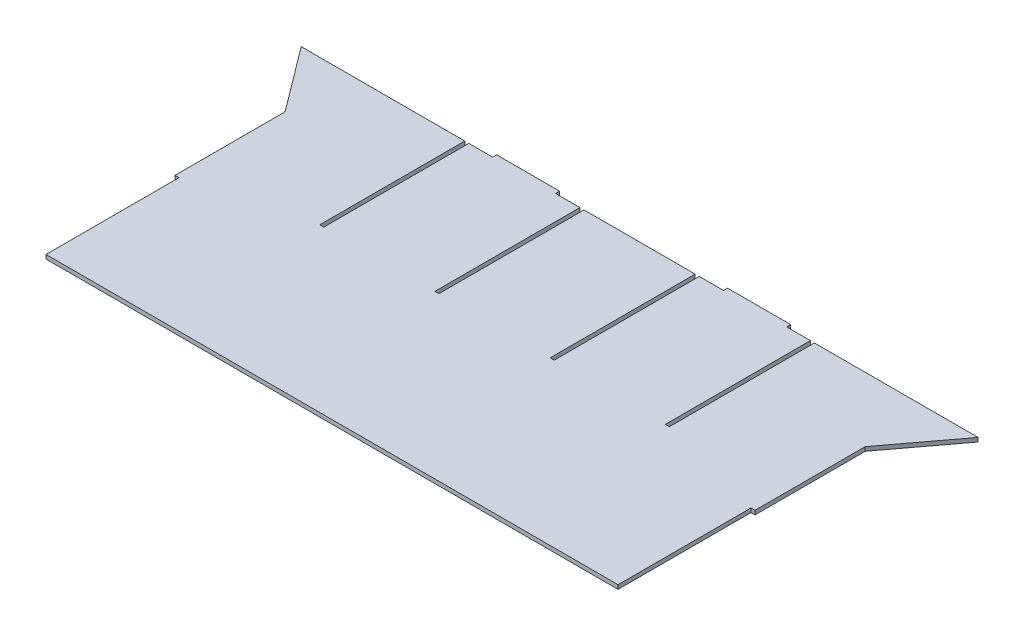
ISO-10303-21;
HEADER;
FILE_DESCRIPTION(('STEP AP214'),'2;1');
FILE_NAME('part.step','',(''),(''),'','','');
FILE_SCHEMA(('AUTOMOTIVE_DESIGN { 1 0 10303 214 1 1 1 1 }'));
ENDSEC;
DATA;
#1=APPLICATION_CONTEXT('core data for automotive mechanical design processes');
#2=APPLICATION_PROTOCOL_DEFINITION('international standard','automotive_design',2000,#1);
#3=PRODUCT_CONTEXT('',#1,'mechanical');
#4=PRODUCT('Part','Part','',(#3));
#5=PRODUCT_RELATED_PRODUCT_CATEGORY('part','',(#4));
#6=PRODUCT_DEFINITION_FORMATION('','',#4);
#7=PRODUCT_DEFINITION_CONTEXT('part definition',#1,'design');
#8=PRODUCT_DEFINITION('design','',#6,#7);
#9=PRODUCT_DEFINITION_SHAPE('','',#8);
#10=(LENGTH_UNIT() NAMED_UNIT(*) SI_UNIT(.MILLI.,.METRE.));
#11=(NAMED_UNIT(*) PLANE_ANGLE_UNIT() SI_UNIT($,.RADIAN.));
#12=(NAMED_UNIT(*) SI_UNIT($,.STERADIAN.) SOLID_ANGLE_UNIT());
#13=UNCERTAINTY_MEASURE_WITH_UNIT(LENGTH_MEASURE(1.E-05),#10,'distance_accuracy_value','');
#14=(GEOMETRIC_REPRESENTATION_CONTEXT(3) GLOBAL_UNCERTAINTY_ASSIGNED_CONTEXT((#13)) GLOBAL_UNIT_ASSIGNED_CONTEXT((#10,
#11,#12)) REPRESENTATION_CONTEXT('',''));
#15=CARTESIAN_POINT('',(0.,0.,0.));
#16=DIRECTION('',(0.,0.,1.));
#17=DIRECTION('',(1.,0.,0.));
#18=AXIS2_PLACEMENT_3D('',#15,#16,#17);
#19=CARTESIAN_POINT('',(228.6010033,-1.5875,242.425000036));
#20=DIRECTION('',(-1.,0.,0.));
#21=DIRECTION('',(0.,0.,1.));
#22=AXIS2_PLACEMENT_3D('',#19,#20,#21);
#23=PLANE('',#22);
#24=DIRECTION('',(0.,-1.,0.));
#25=VECTOR('',#24,1.);
#26=CARTESIAN_POINT('',(228.6010033,1.5875,137.650000036));
#27=LINE('',#26,#25);
#28=CARTESIAN_POINT('',(228.6010033,1.5875,137.650000036));
#29=VERTEX_POINT('',#28);
#30=CARTESIAN_POINT('',(228.6010033,-1.5875,137.650000036));
#31=VERTEX_POINT('',#30);
#32=EDGE_CURVE('E266',#29,#31,#27,.T.);
#33=ORIENTED_EDGE('',*,*,#32,.T.);
#34=DIRECTION('',(0.,0.,-1.));
#35=VECTOR('',#34,1.);
#36=CARTESIAN_POINT('',(228.6010033,-1.5875,242.425000036));
#37=LINE('',#36,#35);
#38=CARTESIAN_POINT('',(228.6010033,-1.5875,50.8));
#39=VERTEX_POINT('',#38);
#40=EDGE_CURVE('E482',#31,#39,#37,.T.);
#41=ORIENTED_EDGE('',*,*,#40,.T.);
#42=DIRECTION('',(0.,-1.,0.));
#43=VECTOR('',#42,1.);
#44=CARTESIAN_POINT('',(228.6010033,1.5875,50.8));
#45=LINE('',#44,#43);
#46=CARTESIAN_POINT('',(228.6010033,1.5875,50.8));
#47=VERTEX_POINT('',#46);
#48=EDGE_CURVE('E309',#47,#39,#45,.T.);
#49=ORIENTED_EDGE('',*,*,#48,.F.);
#50=DIRECTION('',(0.,0.,-1.));
#51=VECTOR('',#50,1.);
#52=CARTESIAN_POINT('',(228.6010033,1.5875,242.425000036));
#53=LINE('',#52,#51);
#54=EDGE_CURVE('E11',#29,#47,#53,.T.);
#55=ORIENTED_EDGE('',*,*,#54,.F.);
#56=EDGE_LOOP('',(#33,#41,#49,#55));
#57=FACE_BOUND('',#56,.T.);
#58=ADVANCED_FACE('F41',(#57),#23,.F.);
#59=CARTESIAN_POINT('',(-228.6010033,1.5875,242.425000036));
#60=DIRECTION('',(0.,-1.,0.));
#61=DIRECTION('',(0.,0.,-1.));
#62=AXIS2_PLACEMENT_3D('',#59,#60,#61);
#63=PLANE('',#62);
#64=DIRECTION('',(-1.,0.,0.));
#65=VECTOR('',#64,1.);
#66=CARTESIAN_POINT('',(228.6010033,1.5875,137.650000036));
#67=LINE('',#66,#65);
#68=CARTESIAN_POINT('',(225.4260033,1.5875,137.650000036));
#69=VERTEX_POINT('',#68);
#70=EDGE_CURVE('E261',#29,#69,#67,.T.);
#71=ORIENTED_EDGE('',*,*,#70,.F.);
#72=ORIENTED_EDGE('',*,*,#54,.T.);
#73=DIRECTION('',(0.6,0.,-0.8));
#74=VECTOR('',#73,1.);
#75=CARTESIAN_POINT('',(266.7010033,1.5875,0.));
#76=LINE('',#75,#74);
#77=CARTESIAN_POINT('',(266.7010033,1.5875,0.));
#78=VERTEX_POINT('',#77);
#79=EDGE_CURVE('E303',#47,#78,#76,.T.);
#80=ORIENTED_EDGE('',*,*,#79,.T.);
#81=DIRECTION('',(-1.,0.,0.));
#82=VECTOR('',#81,1.);
#83=CARTESIAN_POINT('',(-228.6010033,1.5875,0.));
#84=LINE('',#83,#82);
#85=CARTESIAN_POINT('',(137.7960033,1.5875,0.));
#86=VERTEX_POINT('',#85);
#87=EDGE_CURVE('E483',#78,#86,#84,.T.);
#88=ORIENTED_EDGE('',*,*,#87,.T.);
#89=DIRECTION('',(0.,0.,1.));
#90=VECTOR('',#89,1.);
#91=CARTESIAN_POINT('',(137.7960033,1.5875,0.));
#92=LINE('',#91,#90);
#93=CARTESIAN_POINT('',(137.7960033,1.5875,114.3));
#94=VERTEX_POINT('',#93);
#95=EDGE_CURVE('E394',#86,#94,#92,.T.);
#96=ORIENTED_EDGE('',*,*,#95,.T.);
#97=DIRECTION('',(1.,0.,0.));
#98=VECTOR('',#97,1.);
#99=CARTESIAN_POINT('',(0.,1.5875,114.3));
#100=LINE('',#99,#98);
#101=CARTESIAN_POINT('',(134.6210033,1.5875,114.3));
#102=VERTEX_POINT('',#101);
#103=EDGE_CURVE('E454',#102,#94,#100,.T.);
#104=ORIENTED_EDGE('',*,*,#103,.F.);
#105=DIRECTION('',(0.,0.,1.));
#106=VECTOR('',#105,1.);
#107=CARTESIAN_POINT('',(134.6210033,1.5875,0.));
#108=LINE('',#107,#106);
#109=CARTESIAN_POINT('',(134.6210033,1.5875,0.));
#110=VERTEX_POINT('',#109);
#111=EDGE_CURVE('E463',#110,#102,#108,.T.);
#112=ORIENTED_EDGE('',*,*,#111,.F.);
#113=CARTESIAN_POINT('',(115.839003272,1.58749999999999,0.));
#114=VERTEX_POINT('',#113);
#115=EDGE_CURVE('E487',#110,#114,#84,.T.);
#116=ORIENTED_EDGE('',*,*,#115,.T.);
#117=DIRECTION('',(0.,0.,1.));
#118=VECTOR('',#117,1.);
#119=CARTESIAN_POINT('',(115.839003272,1.58749999999999,-3.175));
#120=LINE('',#119,#118);
#121=CARTESIAN_POINT('',(115.839003272,1.58749999999999,-3.175));
#122=VERTEX_POINT('',#121);
#123=EDGE_CURVE('E360',#122,#114,#120,.T.);
#124=ORIENTED_EDGE('',*,*,#123,.F.);
#125=DIRECTION('',(1.,0.,0.));
#126=VECTOR('',#125,1.);
#127=CARTESIAN_POINT('',(115.839003272,1.58749999999999,-3.175));
#128=LINE('',#127,#126);
#129=CARTESIAN_POINT('',(66.1801916664823,1.58749999999999,-3.175));
#130=VERTEX_POINT('',#129);
#131=EDGE_CURVE('E358',#130,#122,#128,.T.);
#132=ORIENTED_EDGE('',*,*,#131,.F.);
#133=DIRECTION('',(0.,0.,1.));
#134=VECTOR('',#133,1.);
#135=CARTESIAN_POINT('',(66.1801916664823,1.58749999999999,-3.175));
#136=LINE('',#135,#134);
#137=CARTESIAN_POINT('',(66.1801916664823,1.5875,0.));
#138=VERTEX_POINT('',#137);
#139=EDGE_CURVE('E366',#130,#138,#136,.T.);
#140=ORIENTED_EDGE('',*,*,#139,.T.);
#141=CARTESIAN_POINT('',(46.9890033,1.5875,0.));
#142=VERTEX_POINT('',#141);
#143=EDGE_CURVE('E512',#138,#142,#84,.T.);
#144=ORIENTED_EDGE('',*,*,#143,.T.);
#145=DIRECTION('',(0.,0.,1.));
#146=VECTOR('',#145,1.);
#147=CARTESIAN_POINT('',(46.9890033,1.5875,0.));
#148=LINE('',#147,#146);
#149=CARTESIAN_POINT('',(46.9890033,1.5875,114.3));
#150=VERTEX_POINT('',#149);
#151=EDGE_CURVE('E383',#142,#150,#148,.T.);
#152=ORIENTED_EDGE('',*,*,#151,.T.);
#153=DIRECTION('',(1.,0.,0.));
#154=VECTOR('',#153,1.);
#155=CARTESIAN_POINT('',(-90.807,1.5875,114.3));
#156=LINE('',#155,#154);
#157=CARTESIAN_POINT('',(43.8140033000001,1.5875,114.3));
#158=VERTEX_POINT('',#157);
#159=EDGE_CURVE('E376',#158,#150,#156,.T.);
#160=ORIENTED_EDGE('',*,*,#159,.F.);
#161=DIRECTION('',(0.,0.,1.));
#162=VECTOR('',#161,1.);
#163=CARTESIAN_POINT('',(43.8140033,1.5875,0.));
#164=LINE('',#163,#162);
#165=CARTESIAN_POINT('',(43.8140033,1.5875,0.));
#166=VERTEX_POINT('',#165);
#167=EDGE_CURVE('E386',#166,#158,#164,.T.);
#168=ORIENTED_EDGE('',*,*,#167,.F.);
#169=CARTESIAN_POINT('',(-43.8179967,1.5875,0.));
#170=VERTEX_POINT('',#169);
#171=EDGE_CURVE('E554',#166,#170,#84,.T.);
#172=ORIENTED_EDGE('',*,*,#171,.T.);
#173=DIRECTION('',(0.,0.,1.));
#174=VECTOR('',#173,1.);
#175=CARTESIAN_POINT('',(-43.8179967,1.5875,0.));
#176=LINE('',#175,#174);
#177=CARTESIAN_POINT('',(-43.8179967,1.5875,114.3));
#178=VERTEX_POINT('',#177);
#179=EDGE_CURVE('E411',#170,#178,#176,.T.);
#180=ORIENTED_EDGE('',*,*,#179,.T.);
#181=DIRECTION('',(1.,0.,0.));
#182=VECTOR('',#181,1.);
#183=CARTESIAN_POINT('',(-181.614,1.5875,114.3));
#184=LINE('',#183,#182);
#185=CARTESIAN_POINT('',(-46.9929966999999,1.5875,114.3));
#186=VERTEX_POINT('',#185);
#187=EDGE_CURVE('E404',#186,#178,#184,.T.);
#188=ORIENTED_EDGE('',*,*,#187,.F.);
#189=DIRECTION('',(0.,0.,1.));
#190=VECTOR('',#189,1.);
#191=CARTESIAN_POINT('',(-46.9929967,1.5875,0.));
#192=LINE('',#191,#190);
#193=CARTESIAN_POINT('',(-46.9929967,1.5875,0.));
#194=VERTEX_POINT('',#193);
#195=EDGE_CURVE('E414',#194,#186,#192,.T.);
#196=ORIENTED_EDGE('',*,*,#195,.F.);
#197=CARTESIAN_POINT('',(-66.2011850664822,1.58749999999999,0.));
#198=VERTEX_POINT('',#197);
#199=EDGE_CURVE('E511',#194,#198,#84,.T.);
#200=ORIENTED_EDGE('',*,*,#199,.T.);
#201=DIRECTION('',(0.,0.,1.));
#202=VECTOR('',#201,1.);
#203=CARTESIAN_POINT('',(-66.2011850664822,1.58749999999999,-3.175));
#204=LINE('',#203,#202);
#205=CARTESIAN_POINT('',(-66.2011850664822,1.58749999999999,-3.175));
#206=VERTEX_POINT('',#205);
#207=EDGE_CURVE('E332',#206,#198,#204,.T.);
#208=ORIENTED_EDGE('',*,*,#207,.F.);
#209=DIRECTION('',(1.,0.,0.));
#210=VECTOR('',#209,1.);
#211=CARTESIAN_POINT('',(-66.2011850664822,1.58749999999999,-3.175));
#212=LINE('',#211,#210);
#213=CARTESIAN_POINT('',(-115.859996672,1.58749999999999,-3.175));
#214=VERTEX_POINT('',#213);
#215=EDGE_CURVE('E334',#214,#206,#212,.T.);
#216=ORIENTED_EDGE('',*,*,#215,.F.);
#217=DIRECTION('',(0.,0.,1.));
#218=VECTOR('',#217,1.);
#219=CARTESIAN_POINT('',(-115.859996672,1.58749999999999,-3.175));
#220=LINE('',#219,#218);
#221=CARTESIAN_POINT('',(-115.859996672,1.5875,0.));
#222=VERTEX_POINT('',#221);
#223=EDGE_CURVE('E330',#214,#222,#220,.T.);
#224=ORIENTED_EDGE('',*,*,#223,.T.);
#225=CARTESIAN_POINT('',(-134.6249967,1.5875,0.));
#226=VERTEX_POINT('',#225);
#227=EDGE_CURVE('E488',#222,#226,#84,.T.);
#228=ORIENTED_EDGE('',*,*,#227,.T.);
#229=DIRECTION('',(0.,0.,1.));
#230=VECTOR('',#229,1.);
#231=CARTESIAN_POINT('',(-134.6249967,1.5875,0.));
#232=LINE('',#231,#230);
#233=CARTESIAN_POINT('',(-134.6249967,1.5875,114.3));
#234=VERTEX_POINT('',#233);
#235=EDGE_CURVE('E372',#226,#234,#232,.T.);
#236=ORIENTED_EDGE('',*,*,#235,.T.);
#237=DIRECTION('',(1.,0.,0.));
#238=VECTOR('',#237,1.);
#239=CARTESIAN_POINT('',(-272.421,1.5875,114.3));
#240=LINE('',#239,#238);
#241=CARTESIAN_POINT('',(-137.7999967,1.5875,114.3));
#242=VERTEX_POINT('',#241);
#243=EDGE_CURVE('E430',#242,#234,#240,.T.);
#244=ORIENTED_EDGE('',*,*,#243,.F.);
#245=DIRECTION('',(0.,0.,1.));
#246=VECTOR('',#245,1.);
#247=CARTESIAN_POINT('',(-137.7999967,1.5875,0.));
#248=LINE('',#247,#246);
#249=CARTESIAN_POINT('',(-137.7999967,1.5875,0.));
#250=VERTEX_POINT('',#249);
#251=EDGE_CURVE('E439',#250,#242,#248,.T.);
#252=ORIENTED_EDGE('',*,*,#251,.F.);
#253=CARTESIAN_POINT('',(-266.7010033,1.5875,0.));
#254=VERTEX_POINT('',#253);
#255=EDGE_CURVE('E470',#250,#254,#84,.T.);
#256=ORIENTED_EDGE('',*,*,#255,.T.);
#257=DIRECTION('',(-0.6,0.,-0.8));
#258=VECTOR('',#257,1.);
#259=CARTESIAN_POINT('',(-266.7010033,1.5875,0.));
#260=LINE('',#259,#258);
#261=CARTESIAN_POINT('',(-228.6010033,1.5875,50.8));
#262=VERTEX_POINT('',#261);
#263=EDGE_CURVE('E315',#262,#254,#260,.T.);
#264=ORIENTED_EDGE('',*,*,#263,.F.);
#265=DIRECTION('',(0.,0.,-1.));
#266=VECTOR('',#265,1.);
#267=CARTESIAN_POINT('',(-228.6010033,1.5875,242.425000036));
#268=LINE('',#267,#266);
#269=CARTESIAN_POINT('',(-228.6010033,1.5875,137.650000036));
#270=VERTEX_POINT('',#269);
#271=EDGE_CURVE('E48',#270,#262,#268,.T.);
#272=ORIENTED_EDGE('',*,*,#271,.F.);
#273=DIRECTION('',(1.,0.,0.));
#274=VECTOR('',#273,1.);
#275=CARTESIAN_POINT('',(-228.6010033,1.5875,137.650000036));
#276=LINE('',#275,#274);
#277=CARTESIAN_POINT('',(-225.4260033,1.5875,137.650000036));
#278=VERTEX_POINT('',#277);
#279=EDGE_CURVE('E288',#270,#278,#276,.T.);
#280=ORIENTED_EDGE('',*,*,#279,.T.);
#281=DIRECTION('',(0.,0.,1.));
#282=VECTOR('',#281,1.);
#283=CARTESIAN_POINT('',(-225.4260033,1.5875,242.425000036));
#284=LINE('',#283,#282);
#285=CARTESIAN_POINT('',(-225.4260033,1.5875,242.425000036));
#286=VERTEX_POINT('',#285);
#287=EDGE_CURVE('E291',#278,#286,#284,.T.);
#288=ORIENTED_EDGE('',*,*,#287,.T.);
#289=DIRECTION('',(-1.,0.,0.));
#290=VECTOR('',#289,1.);
#291=CARTESIAN_POINT('',(-228.6010033,1.5875,242.425000036));
#292=LINE('',#291,#290);
#293=CARTESIAN_POINT('',(225.4260033,1.5875,242.425000036));
#294=VERTEX_POINT('',#293);
#295=EDGE_CURVE('E279',#294,#286,#292,.T.);
#296=ORIENTED_EDGE('',*,*,#295,.F.);
#297=DIRECTION('',(0.,0.,1.));
#298=VECTOR('',#297,1.);
#299=CARTESIAN_POINT('',(225.4260033,1.5875,242.425000036));
#300=LINE('',#299,#298);
#301=EDGE_CURVE('E55',#69,#294,#300,.T.);
#302=ORIENTED_EDGE('',*,*,#301,.F.);
#303=EDGE_LOOP('',(#71,#72,#80,#88,#96,#104,#112,#116,#124,#132,#140,#144,#152,#160,#168,#172,
#180,#188,#196,#200,#208,#216,#224,#228,#236,#244,#252,#256,#264,#272,#280,#288,#296,#302));
#304=FACE_BOUND('',#303,.T.);
#305=ADVANCED_FACE('F277',(#304),#63,.F.);
#306=CARTESIAN_POINT('',(-228.6010033,-1.5875,242.425000036));
#307=DIRECTION('',(0.,1.,0.));
#308=DIRECTION('',(0.,0.,1.));
#309=AXIS2_PLACEMENT_3D('',#306,#307,#308);
#310=PLANE('',#309);
#311=DIRECTION('',(-1.,0.,0.));
#312=VECTOR('',#311,1.);
#313=CARTESIAN_POINT('',(228.6010033,-1.5875,137.650000036));
#314=LINE('',#313,#312);
#315=CARTESIAN_POINT('',(225.4260033,-1.5875,137.650000036));
#316=VERTEX_POINT('',#315);
#317=EDGE_CURVE('E280',#31,#316,#314,.T.);
#318=ORIENTED_EDGE('',*,*,#317,.T.);
#319=DIRECTION('',(0.,0.,1.));
#320=VECTOR('',#319,1.);
#321=CARTESIAN_POINT('',(225.4260033,-1.5875,242.425000036));
#322=LINE('',#321,#320);
#323=CARTESIAN_POINT('',(225.4260033,-1.5875,242.425000036));
#324=VERTEX_POINT('',#323);
#325=EDGE_CURVE('E273',#316,#324,#322,.T.);
#326=ORIENTED_EDGE('',*,*,#325,.T.);
#327=DIRECTION('',(1.,0.,0.));
#328=VECTOR('',#327,1.);
#329=CARTESIAN_POINT('',(-228.6010033,-1.5875,242.425000036));
#330=LINE('',#329,#328);
#331=CARTESIAN_POINT('',(-225.4260033,-1.5875,242.425000036));
#332=VERTEX_POINT('',#331);
#333=EDGE_CURVE('E478',#332,#324,#330,.T.);
#334=ORIENTED_EDGE('',*,*,#333,.F.);
#335=DIRECTION('',(0.,0.,1.));
#336=VECTOR('',#335,1.);
#337=CARTESIAN_POINT('',(-225.4260033,-1.5875,242.425000036));
#338=LINE('',#337,#336);
#339=CARTESIAN_POINT('',(-225.4260033,-1.5875,137.650000036));
#340=VERTEX_POINT('',#339);
#341=EDGE_CURVE('E63',#340,#332,#338,.T.);
#342=ORIENTED_EDGE('',*,*,#341,.F.);
#343=DIRECTION('',(1.,0.,0.));
#344=VECTOR('',#343,1.);
#345=CARTESIAN_POINT('',(-228.6010033,-1.5875,137.650000036));
#346=LINE('',#345,#344);
#347=CARTESIAN_POINT('',(-228.6010033,-1.5875,137.650000036));
#348=VERTEX_POINT('',#347);
#349=EDGE_CURVE('E285',#348,#340,#346,.T.);
#350=ORIENTED_EDGE('',*,*,#349,.F.);
#351=DIRECTION('',(0.,0.,-1.));
#352=VECTOR('',#351,1.);
#353=CARTESIAN_POINT('',(-228.6010033,-1.5875,242.425000036));
#354=LINE('',#353,#352);
#355=CARTESIAN_POINT('',(-228.6010033,-1.5875,50.8));
#356=VERTEX_POINT('',#355);
#357=EDGE_CURVE('E494',#348,#356,#354,.T.);
#358=ORIENTED_EDGE('',*,*,#357,.T.);
#359=DIRECTION('',(-0.6,0.,-0.8));
#360=VECTOR('',#359,1.);
#361=CARTESIAN_POINT('',(-266.7010033,-1.5875,0.));
#362=LINE('',#361,#360);
#363=CARTESIAN_POINT('',(-266.7010033,-1.5875,0.));
#364=VERTEX_POINT('',#363);
#365=EDGE_CURVE('E312',#356,#364,#362,.T.);
#366=ORIENTED_EDGE('',*,*,#365,.T.);
#367=DIRECTION('',(1.,0.,0.));
#368=VECTOR('',#367,1.);
#369=CARTESIAN_POINT('',(-228.6010033,-1.5875,0.));
#370=LINE('',#369,#368);
#371=CARTESIAN_POINT('',(-137.7999967,-1.5875,0.));
#372=VERTEX_POINT('',#371);
#373=EDGE_CURVE('E479',#364,#372,#370,.T.);
#374=ORIENTED_EDGE('',*,*,#373,.T.);
#375=DIRECTION('',(0.,0.,1.));
#376=VECTOR('',#375,1.);
#377=CARTESIAN_POINT('',(-137.7999967,-1.5875,0.));
#378=LINE('',#377,#376);
#379=CARTESIAN_POINT('',(-137.7999967,-1.5875,114.3));
#380=VERTEX_POINT('',#379);
#381=EDGE_CURVE('E429',#372,#380,#378,.T.);
#382=ORIENTED_EDGE('',*,*,#381,.T.);
#383=DIRECTION('',(1.,0.,0.));
#384=VECTOR('',#383,1.);
#385=CARTESIAN_POINT('',(-272.421,-1.5875,114.3));
#386=LINE('',#385,#384);
#387=CARTESIAN_POINT('',(-134.6249967,-1.5875,114.3));
#388=VERTEX_POINT('',#387);
#389=EDGE_CURVE('E433',#380,#388,#386,.T.);
#390=ORIENTED_EDGE('',*,*,#389,.T.);
#391=DIRECTION('',(0.,0.,1.));
#392=VECTOR('',#391,1.);
#393=CARTESIAN_POINT('',(-134.6249967,-1.5875,0.));
#394=LINE('',#393,#392);
#395=CARTESIAN_POINT('',(-134.6249967,-1.5875,0.));
#396=VERTEX_POINT('',#395);
#397=EDGE_CURVE('E427',#396,#388,#394,.T.);
#398=ORIENTED_EDGE('',*,*,#397,.F.);
#399=CARTESIAN_POINT('',(-115.859996672,-1.58749999999996,0.));
#400=VERTEX_POINT('',#399);
#401=EDGE_CURVE('E491',#396,#400,#370,.T.);
#402=ORIENTED_EDGE('',*,*,#401,.T.);
#403=DIRECTION('',(0.,0.,1.));
#404=VECTOR('',#403,1.);
#405=CARTESIAN_POINT('',(-115.859996672,-1.58749999999996,-3.175));
#406=LINE('',#405,#404);
#407=CARTESIAN_POINT('',(-115.859996672,-1.58749999999996,-3.175));
#408=VERTEX_POINT('',#407);
#409=EDGE_CURVE('E328',#408,#400,#406,.T.);
#410=ORIENTED_EDGE('',*,*,#409,.F.);
#411=DIRECTION('',(-1.,0.,0.));
#412=VECTOR('',#411,1.);
#413=CARTESIAN_POINT('',(-66.2011850664822,-1.58749999999996,-3.175));
#414=LINE('',#413,#412);
#415=CARTESIAN_POINT('',(-66.2011850664822,-1.58749999999996,-3.175));
#416=VERTEX_POINT('',#415);
#417=EDGE_CURVE('E346',#416,#408,#414,.T.);
#418=ORIENTED_EDGE('',*,*,#417,.F.);
#419=DIRECTION('',(0.,0.,1.));
#420=VECTOR('',#419,1.);
#421=CARTESIAN_POINT('',(-66.2011850664822,-1.58749999999996,-3.175));
#422=LINE('',#421,#420);
#423=CARTESIAN_POINT('',(-66.2011850664822,-1.58749999999996,0.));
#424=VERTEX_POINT('',#423);
#425=EDGE_CURVE('E324',#416,#424,#422,.T.);
#426=ORIENTED_EDGE('',*,*,#425,.T.);
#427=CARTESIAN_POINT('',(-46.9929967,-1.5875,0.));
#428=VERTEX_POINT('',#427);
#429=EDGE_CURVE('E492',#424,#428,#370,.T.);
#430=ORIENTED_EDGE('',*,*,#429,.T.);
#431=DIRECTION('',(0.,0.,1.));
#432=VECTOR('',#431,1.);
#433=CARTESIAN_POINT('',(-46.9929967,-1.5875,0.));
#434=LINE('',#433,#432);
#435=CARTESIAN_POINT('',(-46.9929966999999,-1.5875,114.3));
#436=VERTEX_POINT('',#435);
#437=EDGE_CURVE('E403',#428,#436,#434,.T.);
#438=ORIENTED_EDGE('',*,*,#437,.T.);
#439=DIRECTION('',(1.,0.,0.));
#440=VECTOR('',#439,1.);
#441=CARTESIAN_POINT('',(-181.614,-1.5875,114.3));
#442=LINE('',#441,#440);
#443=CARTESIAN_POINT('',(-43.8179967,-1.5875,114.3));
#444=VERTEX_POINT('',#443);
#445=EDGE_CURVE('E407',#436,#444,#442,.T.);
#446=ORIENTED_EDGE('',*,*,#445,.T.);
#447=DIRECTION('',(0.,0.,1.));
#448=VECTOR('',#447,1.);
#449=CARTESIAN_POINT('',(-43.8179967,-1.5875,0.));
#450=LINE('',#449,#448);
#451=CARTESIAN_POINT('',(-43.8179967,-1.5875,0.));
#452=VERTEX_POINT('',#451);
#453=EDGE_CURVE('E401',#452,#444,#450,.T.);
#454=ORIENTED_EDGE('',*,*,#453,.F.);
#455=CARTESIAN_POINT('',(43.8140033,-1.5875,0.));
#456=VERTEX_POINT('',#455);
#457=EDGE_CURVE('E576',#452,#456,#370,.T.);
#458=ORIENTED_EDGE('',*,*,#457,.T.);
#459=DIRECTION('',(0.,0.,1.));
#460=VECTOR('',#459,1.);
#461=CARTESIAN_POINT('',(43.8140033,-1.5875,0.));
#462=LINE('',#461,#460);
#463=CARTESIAN_POINT('',(43.8140033000001,-1.5875,114.3));
#464=VERTEX_POINT('',#463);
#465=EDGE_CURVE('E375',#456,#464,#462,.T.);
#466=ORIENTED_EDGE('',*,*,#465,.T.);
#467=DIRECTION('',(1.,0.,0.));
#468=VECTOR('',#467,1.);
#469=CARTESIAN_POINT('',(-90.807,-1.5875,114.3));
#470=LINE('',#469,#468);
#471=CARTESIAN_POINT('',(46.9890033,-1.5875,114.3));
#472=VERTEX_POINT('',#471);
#473=EDGE_CURVE('E379',#464,#472,#470,.T.);
#474=ORIENTED_EDGE('',*,*,#473,.T.);
#475=DIRECTION('',(0.,0.,1.));
#476=VECTOR('',#475,1.);
#477=CARTESIAN_POINT('',(46.9890033,-1.5875,0.));
#478=LINE('',#477,#476);
#479=CARTESIAN_POINT('',(46.9890033,-1.5875,0.));
#480=VERTEX_POINT('',#479);
#481=EDGE_CURVE('E373',#480,#472,#478,.T.);
#482=ORIENTED_EDGE('',*,*,#481,.F.);
#483=CARTESIAN_POINT('',(66.1801916664823,-1.58749999999996,0.));
#484=VERTEX_POINT('',#483);
#485=EDGE_CURVE('E579',#480,#484,#370,.T.);
#486=ORIENTED_EDGE('',*,*,#485,.T.);
#487=DIRECTION('',(0.,0.,1.));
#488=VECTOR('',#487,1.);
#489=CARTESIAN_POINT('',(66.1801916664823,-1.58749999999996,-3.175));
#490=LINE('',#489,#488);
#491=CARTESIAN_POINT('',(66.1801916664823,-1.58749999999996,-3.175));
#492=VERTEX_POINT('',#491);
#493=EDGE_CURVE('E368',#492,#484,#490,.T.);
#494=ORIENTED_EDGE('',*,*,#493,.F.);
#495=DIRECTION('',(-1.,0.,0.));
#496=VECTOR('',#495,1.);
#497=CARTESIAN_POINT('',(115.839003272,-1.58749999999996,-3.175));
#498=LINE('',#497,#496);
#499=CARTESIAN_POINT('',(115.839003272,-1.58749999999996,-3.175));
#500=VERTEX_POINT('',#499);
#501=EDGE_CURVE('E353',#500,#492,#498,.T.);
#502=ORIENTED_EDGE('',*,*,#501,.F.);
#503=DIRECTION('',(0.,0.,1.));
#504=VECTOR('',#503,1.);
#505=CARTESIAN_POINT('',(115.839003272,-1.58749999999996,-3.175));
#506=LINE('',#505,#504);
#507=CARTESIAN_POINT('',(115.839003272,-1.58749999999996,0.));
#508=VERTEX_POINT('',#507);
#509=EDGE_CURVE('E370',#500,#508,#506,.T.);
#510=ORIENTED_EDGE('',*,*,#509,.T.);
#511=CARTESIAN_POINT('',(134.6210033,-1.5875,0.));
#512=VERTEX_POINT('',#511);
#513=EDGE_CURVE('E577',#508,#512,#370,.T.);
#514=ORIENTED_EDGE('',*,*,#513,.T.);
#515=DIRECTION('',(0.,0.,1.));
#516=VECTOR('',#515,1.);
#517=CARTESIAN_POINT('',(134.6210033,-1.5875,0.));
#518=LINE('',#517,#516);
#519=CARTESIAN_POINT('',(134.6210033,-1.5875,114.3));
#520=VERTEX_POINT('',#519);
#521=EDGE_CURVE('E453',#512,#520,#518,.T.);
#522=ORIENTED_EDGE('',*,*,#521,.T.);
#523=DIRECTION('',(1.,0.,0.));
#524=VECTOR('',#523,1.);
#525=CARTESIAN_POINT('',(0.,-1.5875,114.3));
#526=LINE('',#525,#524);
#527=CARTESIAN_POINT('',(137.7960033,-1.5875,114.3));
#528=VERTEX_POINT('',#527);
#529=EDGE_CURVE('E457',#520,#528,#526,.T.);
#530=ORIENTED_EDGE('',*,*,#529,.T.);
#531=DIRECTION('',(0.,0.,1.));
#532=VECTOR('',#531,1.);
#533=CARTESIAN_POINT('',(137.7960033,-1.5875,0.));
#534=LINE('',#533,#532);
#535=CARTESIAN_POINT('',(137.7960033,-1.5875,0.));
#536=VERTEX_POINT('',#535);
#537=EDGE_CURVE('E451',#536,#528,#534,.T.);
#538=ORIENTED_EDGE('',*,*,#537,.F.);
#539=CARTESIAN_POINT('',(266.7010033,-1.5875,0.));
#540=VERTEX_POINT('',#539);
#541=EDGE_CURVE('E486',#536,#540,#370,.T.);
#542=ORIENTED_EDGE('',*,*,#541,.T.);
#543=DIRECTION('',(0.6,0.,-0.8));
#544=VECTOR('',#543,1.);
#545=CARTESIAN_POINT('',(266.7010033,-1.5875,0.));
#546=LINE('',#545,#544);
#547=EDGE_CURVE('E299',#39,#540,#546,.T.);
#548=ORIENTED_EDGE('',*,*,#547,.F.);
#549=ORIENTED_EDGE('',*,*,#40,.F.);
#550=EDGE_LOOP('',(#318,#326,#334,#342,#350,#358,#366,#374,#382,#390,#398,#402,#410,#418,#426,
#430,#438,#446,#454,#458,#466,#474,#482,#486,#494,#502,#510,#514,#522,#530,#538,#542,#548,#549));
#551=FACE_BOUND('',#550,.T.);
#552=ADVANCED_FACE('F515',(#551),#310,.F.);
#553=CARTESIAN_POINT('',(0.,0.,242.425000036));
#554=DIRECTION('',(0.,0.,-1.));
#555=DIRECTION('',(-1.,0.,0.));
#556=AXIS2_PLACEMENT_3D('',#553,#554,#555);
#557=PLANE('',#556);
#558=DIRECTION('',(0.,-1.,0.));
#559=VECTOR('',#558,1.);
#560=CARTESIAN_POINT('',(225.4260033,1.5875,242.425000036));
#561=LINE('',#560,#559);
#562=EDGE_CURVE('E269',#294,#324,#561,.T.);
#563=ORIENTED_EDGE('',*,*,#562,.F.);
#564=ORIENTED_EDGE('',*,*,#295,.T.);
#565=DIRECTION('',(0.,-1.,0.));
#566=VECTOR('',#565,1.);
#567=CARTESIAN_POINT('',(-225.4260033,1.5875,242.425000036));
#568=LINE('',#567,#566);
#569=EDGE_CURVE('E297',#286,#332,#568,.T.);
#570=ORIENTED_EDGE('',*,*,#569,.T.);
#571=ORIENTED_EDGE('',*,*,#333,.T.);
#572=EDGE_LOOP('',(#563,#564,#570,#571));
#573=FACE_BOUND('',#572,.T.);
#574=ADVANCED_FACE('F523',(#573),#557,.F.);
#575=CARTESIAN_POINT('',(0.,0.,0.));
#576=DIRECTION('',(0.,0.,-1.));
#577=DIRECTION('',(-1.,0.,0.));
#578=AXIS2_PLACEMENT_3D('',#575,#576,#577);
#579=PLANE('',#578);
#580=ORIENTED_EDGE('',*,*,#429,.F.);
#581=DIRECTION('',(0.,-1.,0.));
#582=VECTOR('',#581,1.);
#583=CARTESIAN_POINT('',(-66.2011850664822,1.58749999999999,0.));
#584=LINE('',#583,#582);
#585=EDGE_CURVE('E338',#198,#424,#584,.T.);
#586=ORIENTED_EDGE('',*,*,#585,.F.);
#587=ORIENTED_EDGE('',*,*,#199,.F.);
#588=DIRECTION('',(0.,1.,0.));
#589=VECTOR('',#588,1.);
#590=CARTESIAN_POINT('',(-46.9929967,-1.5875,0.));
#591=LINE('',#590,#589);
#592=EDGE_CURVE('E423',#428,#194,#591,.T.);
#593=ORIENTED_EDGE('',*,*,#592,.F.);
#594=EDGE_LOOP('',(#580,#586,#587,#593));
#595=FACE_BOUND('',#594,.T.);
#596=ADVANCED_FACE('F613',(#595),#579,.T.);
#597=ORIENTED_EDGE('',*,*,#227,.F.);
#598=DIRECTION('',(0.,1.,0.));
#599=VECTOR('',#598,1.);
#600=CARTESIAN_POINT('',(-115.859996672,1.58749999999999,0.));
#601=LINE('',#600,#599);
#602=EDGE_CURVE('E335',#400,#222,#601,.T.);
#603=ORIENTED_EDGE('',*,*,#602,.F.);
#604=ORIENTED_EDGE('',*,*,#401,.F.);
#605=DIRECTION('',(0.,1.,0.));
#606=VECTOR('',#605,1.);
#607=CARTESIAN_POINT('',(-134.6249967,-1.5875,0.));
#608=LINE('',#607,#606);
#609=EDGE_CURVE('E436',#396,#226,#608,.T.);
#610=ORIENTED_EDGE('',*,*,#609,.T.);
#611=EDGE_LOOP('',(#597,#603,#604,#610));
#612=FACE_BOUND('',#611,.T.);
#613=ADVANCED_FACE('F573',(#612),#579,.T.);
#614=ORIENTED_EDGE('',*,*,#513,.F.);
#615=DIRECTION('',(0.,-1.,0.));
#616=VECTOR('',#615,1.);
#617=CARTESIAN_POINT('',(115.839003272,1.58749999999999,0.));
#618=LINE('',#617,#616);
#619=EDGE_CURVE('E342',#114,#508,#618,.T.);
#620=ORIENTED_EDGE('',*,*,#619,.F.);
#621=ORIENTED_EDGE('',*,*,#115,.F.);
#622=DIRECTION('',(0.,1.,0.));
#623=VECTOR('',#622,1.);
#624=CARTESIAN_POINT('',(134.6210033,-1.5875,0.));
#625=LINE('',#624,#623);
#626=EDGE_CURVE('E473',#512,#110,#625,.T.);
#627=ORIENTED_EDGE('',*,*,#626,.F.);
#628=EDGE_LOOP('',(#614,#620,#621,#627));
#629=FACE_BOUND('',#628,.T.);
#630=ADVANCED_FACE('F553',(#629),#579,.T.);
#631=ORIENTED_EDGE('',*,*,#143,.F.);
#632=DIRECTION('',(0.,1.,0.));
#633=VECTOR('',#632,1.);
#634=CARTESIAN_POINT('',(66.1801916664823,1.58749999999999,0.));
#635=LINE('',#634,#633);
#636=EDGE_CURVE('E354',#484,#138,#635,.T.);
#637=ORIENTED_EDGE('',*,*,#636,.F.);
#638=ORIENTED_EDGE('',*,*,#485,.F.);
#639=DIRECTION('',(0.,1.,0.));
#640=VECTOR('',#639,1.);
#641=CARTESIAN_POINT('',(46.9890033,-1.5875,0.));
#642=LINE('',#641,#640);
#643=EDGE_CURVE('E382',#480,#142,#642,.T.);
#644=ORIENTED_EDGE('',*,*,#643,.T.);
#645=EDGE_LOOP('',(#631,#637,#638,#644));
#646=FACE_BOUND('',#645,.T.);
#647=ADVANCED_FACE('F638',(#646),#579,.T.);
#648=DIRECTION('',(0.,1.,0.));
#649=VECTOR('',#648,1.);
#650=CARTESIAN_POINT('',(43.8140033,-1.5875,0.));
#651=LINE('',#650,#649);
#652=EDGE_CURVE('E397',#456,#166,#651,.T.);
#653=ORIENTED_EDGE('',*,*,#652,.F.);
#654=ORIENTED_EDGE('',*,*,#457,.F.);
#655=DIRECTION('',(0.,1.,0.));
#656=VECTOR('',#655,1.);
#657=CARTESIAN_POINT('',(-43.8179967,-1.5875,0.));
#658=LINE('',#657,#656);
#659=EDGE_CURVE('E410',#452,#170,#658,.T.);
#660=ORIENTED_EDGE('',*,*,#659,.T.);
#661=ORIENTED_EDGE('',*,*,#171,.F.);
#662=EDGE_LOOP('',(#653,#654,#660,#661));
#663=FACE_BOUND('',#662,.T.);
#664=ADVANCED_FACE('F634',(#663),#579,.T.);
#665=ORIENTED_EDGE('',*,*,#541,.F.);
#666=DIRECTION('',(0.,1.,0.));
#667=VECTOR('',#666,1.);
#668=CARTESIAN_POINT('',(137.7960033,-1.5875,0.));
#669=LINE('',#668,#667);
#670=EDGE_CURVE('E460',#536,#86,#669,.T.);
#671=ORIENTED_EDGE('',*,*,#670,.T.);
#672=ORIENTED_EDGE('',*,*,#87,.F.);
#673=DIRECTION('',(0.,-1.,0.));
#674=VECTOR('',#673,1.);
#675=CARTESIAN_POINT('',(266.7010033,1.5875,0.));
#676=LINE('',#675,#674);
#677=EDGE_CURVE('E306',#78,#540,#676,.T.);
#678=ORIENTED_EDGE('',*,*,#677,.T.);
#679=EDGE_LOOP('',(#665,#671,#672,#678));
#680=FACE_BOUND('',#679,.T.);
#681=ADVANCED_FACE('F534',(#680),#579,.T.);
#682=CARTESIAN_POINT('',(-228.6010033,-1.5875,242.425000036));
#683=DIRECTION('',(1.,0.,0.));
#684=DIRECTION('',(0.,0.,-1.));
#685=AXIS2_PLACEMENT_3D('',#682,#683,#684);
#686=PLANE('',#685);
#687=ORIENTED_EDGE('',*,*,#357,.F.);
#688=DIRECTION('',(0.,-1.,0.));
#689=VECTOR('',#688,1.);
#690=CARTESIAN_POINT('',(-228.6010033,1.5875,137.650000036));
#691=LINE('',#690,#689);
#692=EDGE_CURVE('E293',#270,#348,#691,.T.);
#693=ORIENTED_EDGE('',*,*,#692,.F.);
#694=ORIENTED_EDGE('',*,*,#271,.T.);
#695=DIRECTION('',(0.,-1.,0.));
#696=VECTOR('',#695,1.);
#697=CARTESIAN_POINT('',(-228.6010033,1.5875,50.8));
#698=LINE('',#697,#696);
#699=EDGE_CURVE('E318',#262,#356,#698,.T.);
#700=ORIENTED_EDGE('',*,*,#699,.T.);
#701=EDGE_LOOP('',(#687,#693,#694,#700));
#702=FACE_BOUND('',#701,.T.);
#703=ADVANCED_FACE('F500',(#702),#686,.F.);
#704=DIRECTION('',(0.,1.,0.));
#705=VECTOR('',#704,1.);
#706=CARTESIAN_POINT('',(-137.7999967,-1.5875,0.));
#707=LINE('',#706,#705);
#708=EDGE_CURVE('E447',#372,#250,#707,.T.);
#709=ORIENTED_EDGE('',*,*,#708,.F.);
#710=ORIENTED_EDGE('',*,*,#373,.F.);
#711=DIRECTION('',(0.,-1.,0.));
#712=VECTOR('',#711,1.);
#713=CARTESIAN_POINT('',(-266.7010033,1.5875,0.));
#714=LINE('',#713,#712);
#715=EDGE_CURVE('E321',#254,#364,#714,.T.);
#716=ORIENTED_EDGE('',*,*,#715,.F.);
#717=ORIENTED_EDGE('',*,*,#255,.F.);
#718=EDGE_LOOP('',(#709,#710,#716,#717));
#719=FACE_BOUND('',#718,.T.);
#720=ADVANCED_FACE('F513',(#719),#579,.T.);
#721=CARTESIAN_POINT('',(137.7960033,-1.5875,0.));
#722=DIRECTION('',(-1.,0.,0.));
#723=DIRECTION('',(0.,0.,1.));
#724=AXIS2_PLACEMENT_3D('',#721,#722,#723);
#725=PLANE('',#724);
#726=ORIENTED_EDGE('',*,*,#95,.F.);
#727=ORIENTED_EDGE('',*,*,#670,.F.);
#728=ORIENTED_EDGE('',*,*,#537,.T.);
#729=DIRECTION('',(0.,1.,0.));
#730=VECTOR('',#729,1.);
#731=CARTESIAN_POINT('',(137.7960033,-1.5875,114.3));
#732=LINE('',#731,#730);
#733=EDGE_CURVE('E468',#528,#94,#732,.T.);
#734=ORIENTED_EDGE('',*,*,#733,.T.);
#735=EDGE_LOOP('',(#726,#727,#728,#734));
#736=FACE_BOUND('',#735,.T.);
#737=ADVANCED_FACE('F537',(#736),#725,.T.);
#738=CARTESIAN_POINT('',(0.,-1.5875,114.3));
#739=DIRECTION('',(0.,0.,1.));
#740=DIRECTION('',(1.,0.,0.));
#741=AXIS2_PLACEMENT_3D('',#738,#739,#740);
#742=PLANE('',#741);
#743=ORIENTED_EDGE('',*,*,#103,.T.);
#744=ORIENTED_EDGE('',*,*,#733,.F.);
#745=ORIENTED_EDGE('',*,*,#529,.F.);
#746=DIRECTION('',(0.,1.,0.));
#747=VECTOR('',#746,1.);
#748=CARTESIAN_POINT('',(134.6210033,-1.5875,114.3));
#749=LINE('',#748,#747);
#750=EDGE_CURVE('E471',#520,#102,#749,.T.);
#751=ORIENTED_EDGE('',*,*,#750,.T.);
#752=EDGE_LOOP('',(#743,#744,#745,#751));
#753=FACE_BOUND('',#752,.T.);
#754=ADVANCED_FACE('F542',(#753),#742,.F.);
#755=CARTESIAN_POINT('',(134.6210033,-1.5875,0.));
#756=DIRECTION('',(-1.,0.,0.));
#757=DIRECTION('',(0.,0.,1.));
#758=AXIS2_PLACEMENT_3D('',#755,#756,#757);
#759=PLANE('',#758);
#760=ORIENTED_EDGE('',*,*,#111,.T.);
#761=ORIENTED_EDGE('',*,*,#750,.F.);
#762=ORIENTED_EDGE('',*,*,#521,.F.);
#763=ORIENTED_EDGE('',*,*,#626,.T.);
#764=EDGE_LOOP('',(#760,#761,#762,#763));
#765=FACE_BOUND('',#764,.T.);
#766=ADVANCED_FACE('F587',(#765),#759,.F.);
#767=CARTESIAN_POINT('',(-134.6249967,-1.5875,0.));
#768=DIRECTION('',(-1.,0.,0.));
#769=DIRECTION('',(0.,0.,1.));
#770=AXIS2_PLACEMENT_3D('',#767,#768,#769);
#771=PLANE('',#770);
#772=ORIENTED_EDGE('',*,*,#235,.F.);
#773=ORIENTED_EDGE('',*,*,#609,.F.);
#774=ORIENTED_EDGE('',*,*,#397,.T.);
#775=DIRECTION('',(0.,1.,0.));
#776=VECTOR('',#775,1.);
#777=CARTESIAN_POINT('',(-134.6249967,-1.5875,114.3));
#778=LINE('',#777,#776);
#779=EDGE_CURVE('E415',#388,#234,#778,.T.);
#780=ORIENTED_EDGE('',*,*,#779,.T.);
#781=EDGE_LOOP('',(#772,#773,#774,#780));
#782=FACE_BOUND('',#781,.T.);
#783=ADVANCED_FACE('F569',(#782),#771,.T.);
#784=CARTESIAN_POINT('',(-272.421,-1.5875,114.3));
#785=DIRECTION('',(0.,0.,1.));
#786=DIRECTION('',(1.,0.,0.));
#787=AXIS2_PLACEMENT_3D('',#784,#785,#786);
#788=PLANE('',#787);
#789=ORIENTED_EDGE('',*,*,#243,.T.);
#790=ORIENTED_EDGE('',*,*,#779,.F.);
#791=ORIENTED_EDGE('',*,*,#389,.F.);
#792=DIRECTION('',(0.,1.,0.));
#793=VECTOR('',#792,1.);
#794=CARTESIAN_POINT('',(-137.7999967,-1.5875,114.3));
#795=LINE('',#794,#793);
#796=EDGE_CURVE('E445',#380,#242,#795,.T.);
#797=ORIENTED_EDGE('',*,*,#796,.T.);
#798=EDGE_LOOP('',(#789,#790,#791,#797));
#799=FACE_BOUND('',#798,.T.);
#800=ADVANCED_FACE('F595',(#799),#788,.F.);
#801=CARTESIAN_POINT('',(-137.7999967,-1.5875,0.));
#802=DIRECTION('',(-1.,0.,0.));
#803=DIRECTION('',(0.,0.,1.));
#804=AXIS2_PLACEMENT_3D('',#801,#802,#803);
#805=PLANE('',#804);
#806=ORIENTED_EDGE('',*,*,#251,.T.);
#807=ORIENTED_EDGE('',*,*,#796,.F.);
#808=ORIENTED_EDGE('',*,*,#381,.F.);
#809=ORIENTED_EDGE('',*,*,#708,.T.);
#810=EDGE_LOOP('',(#806,#807,#808,#809));
#811=FACE_BOUND('',#810,.T.);
#812=ADVANCED_FACE('F653',(#811),#805,.F.);
#813=CARTESIAN_POINT('',(-43.8179967,-1.5875,0.));
#814=DIRECTION('',(-1.,0.,0.));
#815=DIRECTION('',(0.,0.,1.));
#816=AXIS2_PLACEMENT_3D('',#813,#814,#815);
#817=PLANE('',#816);
#818=ORIENTED_EDGE('',*,*,#179,.F.);
#819=ORIENTED_EDGE('',*,*,#659,.F.);
#820=ORIENTED_EDGE('',*,*,#453,.T.);
#821=DIRECTION('',(0.,1.,0.));
#822=VECTOR('',#821,1.);
#823=CARTESIAN_POINT('',(-43.8179967,-1.5875,114.3));
#824=LINE('',#823,#822);
#825=EDGE_CURVE('E387',#444,#178,#824,.T.);
#826=ORIENTED_EDGE('',*,*,#825,.T.);
#827=EDGE_LOOP('',(#818,#819,#820,#826));
#828=FACE_BOUND('',#827,.T.);
#829=ADVANCED_FACE('F663',(#828),#817,.T.);
#830=CARTESIAN_POINT('',(-181.614,-1.5875,114.3));
#831=DIRECTION('',(0.,0.,1.));
#832=DIRECTION('',(1.,0.,0.));
#833=AXIS2_PLACEMENT_3D('',#830,#831,#832);
#834=PLANE('',#833);
#835=ORIENTED_EDGE('',*,*,#187,.T.);
#836=ORIENTED_EDGE('',*,*,#825,.F.);
#837=ORIENTED_EDGE('',*,*,#445,.F.);
#838=DIRECTION('',(0.,1.,0.));
#839=VECTOR('',#838,1.);
#840=CARTESIAN_POINT('',(-46.9929966999999,-1.5875,114.3));
#841=LINE('',#840,#839);
#842=EDGE_CURVE('E421',#436,#186,#841,.T.);
#843=ORIENTED_EDGE('',*,*,#842,.T.);
#844=EDGE_LOOP('',(#835,#836,#837,#843));
#845=FACE_BOUND('',#844,.T.);
#846=ADVANCED_FACE('F673',(#845),#834,.F.);
#847=CARTESIAN_POINT('',(-46.9929967,-1.5875,0.));
#848=DIRECTION('',(-1.,0.,0.));
#849=DIRECTION('',(0.,0.,1.));
#850=AXIS2_PLACEMENT_3D('',#847,#848,#849);
#851=PLANE('',#850);
#852=ORIENTED_EDGE('',*,*,#195,.T.);
#853=ORIENTED_EDGE('',*,*,#842,.F.);
#854=ORIENTED_EDGE('',*,*,#437,.F.);
#855=ORIENTED_EDGE('',*,*,#592,.T.);
#856=EDGE_LOOP('',(#852,#853,#854,#855));
#857=FACE_BOUND('',#856,.T.);
#858=ADVANCED_FACE('F683',(#857),#851,.F.);
#859=CARTESIAN_POINT('',(46.9890033,-1.5875,0.));
#860=DIRECTION('',(-1.,0.,0.));
#861=DIRECTION('',(0.,0.,1.));
#862=AXIS2_PLACEMENT_3D('',#859,#860,#861);
#863=PLANE('',#862);
#864=ORIENTED_EDGE('',*,*,#151,.F.);
#865=ORIENTED_EDGE('',*,*,#643,.F.);
#866=ORIENTED_EDGE('',*,*,#481,.T.);
#867=DIRECTION('',(0.,1.,0.));
#868=VECTOR('',#867,1.);
#869=CARTESIAN_POINT('',(46.9890033,-1.5875,114.3));
#870=LINE('',#869,#868);
#871=EDGE_CURVE('E392',#472,#150,#870,.T.);
#872=ORIENTED_EDGE('',*,*,#871,.T.);
#873=EDGE_LOOP('',(#864,#865,#866,#872));
#874=FACE_BOUND('',#873,.T.);
#875=ADVANCED_FACE('F693',(#874),#863,.T.);
#876=CARTESIAN_POINT('',(-90.807,-1.5875,114.3));
#877=DIRECTION('',(0.,0.,1.));
#878=DIRECTION('',(1.,0.,0.));
#879=AXIS2_PLACEMENT_3D('',#876,#877,#878);
#880=PLANE('',#879);
#881=ORIENTED_EDGE('',*,*,#159,.T.);
#882=ORIENTED_EDGE('',*,*,#871,.F.);
#883=ORIENTED_EDGE('',*,*,#473,.F.);
#884=DIRECTION('',(0.,1.,0.));
#885=VECTOR('',#884,1.);
#886=CARTESIAN_POINT('',(43.8140033000001,-1.5875,114.3));
#887=LINE('',#886,#885);
#888=EDGE_CURVE('E395',#464,#158,#887,.T.);
#889=ORIENTED_EDGE('',*,*,#888,.T.);
#890=EDGE_LOOP('',(#881,#882,#883,#889));
#891=FACE_BOUND('',#890,.T.);
#892=ADVANCED_FACE('F703',(#891),#880,.F.);
#893=CARTESIAN_POINT('',(43.8140033,-1.5875,0.));
#894=DIRECTION('',(-1.,0.,0.));
#895=DIRECTION('',(0.,0.,1.));
#896=AXIS2_PLACEMENT_3D('',#893,#894,#895);
#897=PLANE('',#896);
#898=ORIENTED_EDGE('',*,*,#167,.T.);
#899=ORIENTED_EDGE('',*,*,#888,.F.);
#900=ORIENTED_EDGE('',*,*,#465,.F.);
#901=ORIENTED_EDGE('',*,*,#652,.T.);
#902=EDGE_LOOP('',(#898,#899,#900,#901));
#903=FACE_BOUND('',#902,.T.);
#904=ADVANCED_FACE('F713',(#903),#897,.F.);
#905=CARTESIAN_POINT('',(115.839003272,1.58749999999999,-3.175));
#906=DIRECTION('',(-1.,0.,0.));
#907=DIRECTION('',(0.,0.,1.));
#908=AXIS2_PLACEMENT_3D('',#905,#906,#907);
#909=PLANE('',#908);
#910=ORIENTED_EDGE('',*,*,#619,.T.);
#911=ORIENTED_EDGE('',*,*,#509,.F.);
#912=DIRECTION('',(0.,-1.,0.));
#913=VECTOR('',#912,1.);
#914=CARTESIAN_POINT('',(115.839003272,1.58749999999999,-3.175));
#915=LINE('',#914,#913);
#916=EDGE_CURVE('E350',#122,#500,#915,.T.);
#917=ORIENTED_EDGE('',*,*,#916,.F.);
#918=ORIENTED_EDGE('',*,*,#123,.T.);
#919=EDGE_LOOP('',(#910,#911,#917,#918));
#920=FACE_BOUND('',#919,.T.);
#921=ADVANCED_FACE('F723',(#920),#909,.F.);
#922=CARTESIAN_POINT('',(66.1801916664823,1.58749999999999,-3.175));
#923=DIRECTION('',(1.,0.,0.));
#924=DIRECTION('',(0.,0.,-1.));
#925=AXIS2_PLACEMENT_3D('',#922,#923,#924);
#926=PLANE('',#925);
#927=ORIENTED_EDGE('',*,*,#636,.T.);
#928=ORIENTED_EDGE('',*,*,#139,.F.);
#929=DIRECTION('',(0.,1.,0.));
#930=VECTOR('',#929,1.);
#931=CARTESIAN_POINT('',(66.1801916664823,1.58749999999999,-3.175));
#932=LINE('',#931,#930);
#933=EDGE_CURVE('E356',#492,#130,#932,.T.);
#934=ORIENTED_EDGE('',*,*,#933,.F.);
#935=ORIENTED_EDGE('',*,*,#493,.T.);
#936=EDGE_LOOP('',(#927,#928,#934,#935));
#937=FACE_BOUND('',#936,.T.);
#938=ADVANCED_FACE('F759',(#937),#926,.F.);
#939=CARTESIAN_POINT('',(0.,0.,-3.175));
#940=DIRECTION('',(0.,0.,-1.));
#941=DIRECTION('',(-1.,0.,0.));
#942=AXIS2_PLACEMENT_3D('',#939,#940,#941);
#943=PLANE('',#942);
#944=ORIENTED_EDGE('',*,*,#916,.T.);
#945=ORIENTED_EDGE('',*,*,#501,.T.);
#946=ORIENTED_EDGE('',*,*,#933,.T.);
#947=ORIENTED_EDGE('',*,*,#131,.T.);
#948=EDGE_LOOP('',(#944,#945,#946,#947));
#949=FACE_BOUND('',#948,.T.);
#950=ADVANCED_FACE('F769',(#949),#943,.T.);
#951=CARTESIAN_POINT('',(-66.2011850664822,1.58749999999999,-3.175));
#952=DIRECTION('',(-1.,0.,0.));
#953=DIRECTION('',(0.,0.,1.));
#954=AXIS2_PLACEMENT_3D('',#951,#952,#953);
#955=PLANE('',#954);
#956=ORIENTED_EDGE('',*,*,#585,.T.);
#957=ORIENTED_EDGE('',*,*,#425,.F.);
#958=DIRECTION('',(0.,-1.,0.));
#959=VECTOR('',#958,1.);
#960=CARTESIAN_POINT('',(-66.2011850664822,1.58749999999999,-3.175));
#961=LINE('',#960,#959);
#962=EDGE_CURVE('E339',#206,#416,#961,.T.);
#963=ORIENTED_EDGE('',*,*,#962,.F.);
#964=ORIENTED_EDGE('',*,*,#207,.T.);
#965=EDGE_LOOP('',(#956,#957,#963,#964));
#966=FACE_BOUND('',#965,.T.);
#967=ADVANCED_FACE('F779',(#966),#955,.F.);
#968=CARTESIAN_POINT('',(-115.859996672,1.58749999999999,-3.175));
#969=DIRECTION('',(1.,0.,0.));
#970=DIRECTION('',(0.,0.,-1.));
#971=AXIS2_PLACEMENT_3D('',#968,#969,#970);
#972=PLANE('',#971);
#973=ORIENTED_EDGE('',*,*,#602,.T.);
#974=ORIENTED_EDGE('',*,*,#223,.F.);
#975=DIRECTION('',(0.,1.,0.));
#976=VECTOR('',#975,1.);
#977=CARTESIAN_POINT('',(-115.859996672,1.58749999999999,-3.175));
#978=LINE('',#977,#976);
#979=EDGE_CURVE('E344',#408,#214,#978,.T.);
#980=ORIENTED_EDGE('',*,*,#979,.F.);
#981=ORIENTED_EDGE('',*,*,#409,.T.);
#982=EDGE_LOOP('',(#973,#974,#980,#981));
#983=FACE_BOUND('',#982,.T.);
#984=ADVANCED_FACE('F789',(#983),#972,.F.);
#985=CARTESIAN_POINT('',(0.,0.,-3.175));
#986=DIRECTION('',(0.,0.,-1.));
#987=DIRECTION('',(-1.,0.,0.));
#988=AXIS2_PLACEMENT_3D('',#985,#986,#987);
#989=PLANE('',#988);
#990=ORIENTED_EDGE('',*,*,#962,.T.);
#991=ORIENTED_EDGE('',*,*,#417,.T.);
#992=ORIENTED_EDGE('',*,*,#979,.T.);
#993=ORIENTED_EDGE('',*,*,#215,.T.);
#994=EDGE_LOOP('',(#990,#991,#992,#993));
#995=FACE_BOUND('',#994,.T.);
#996=ADVANCED_FACE('F799',(#995),#989,.T.);
#997=CARTESIAN_POINT('',(-266.7010033,1.5875,0.));
#998=DIRECTION('',(-0.8,0.,0.6));
#999=DIRECTION('',(0.6,0.,0.8));
#1000=AXIS2_PLACEMENT_3D('',#997,#998,#999);
#1001=PLANE('',#1000);
#1002=ORIENTED_EDGE('',*,*,#365,.F.);
#1003=ORIENTED_EDGE('',*,*,#699,.F.);
#1004=ORIENTED_EDGE('',*,*,#263,.T.);
#1005=ORIENTED_EDGE('',*,*,#715,.T.);
#1006=EDGE_LOOP('',(#1002,#1003,#1004,#1005));
#1007=FACE_BOUND('',#1006,.T.);
#1008=ADVANCED_FACE('F504',(#1007),#1001,.T.);
#1009=CARTESIAN_POINT('',(266.7010033,1.5875,0.));
#1010=DIRECTION('',(-0.8,0.,-0.6));
#1011=DIRECTION('',(-0.6,0.,0.8));
#1012=AXIS2_PLACEMENT_3D('',#1009,#1010,#1011);
#1013=PLANE('',#1012);
#1014=ORIENTED_EDGE('',*,*,#547,.T.);
#1015=ORIENTED_EDGE('',*,*,#677,.F.);
#1016=ORIENTED_EDGE('',*,*,#79,.F.);
#1017=ORIENTED_EDGE('',*,*,#48,.T.);
#1018=EDGE_LOOP('',(#1014,#1015,#1016,#1017));
#1019=FACE_BOUND('',#1018,.T.);
#1020=ADVANCED_FACE('F531',(#1019),#1013,.F.);
#1021=CARTESIAN_POINT('',(-225.4260033,1.5875,242.425000036));
#1022=DIRECTION('',(1.,0.,0.));
#1023=DIRECTION('',(0.,0.,-1.));
#1024=AXIS2_PLACEMENT_3D('',#1021,#1022,#1023);
#1025=PLANE('',#1024);
#1026=ORIENTED_EDGE('',*,*,#341,.T.);
#1027=ORIENTED_EDGE('',*,*,#569,.F.);
#1028=ORIENTED_EDGE('',*,*,#287,.F.);
#1029=DIRECTION('',(0.,-1.,0.));
#1030=VECTOR('',#1029,1.);
#1031=CARTESIAN_POINT('',(-225.4260033,1.5875,137.650000036));
#1032=LINE('',#1031,#1030);
#1033=EDGE_CURVE('E300',#278,#340,#1032,.T.);
#1034=ORIENTED_EDGE('',*,*,#1033,.T.);
#1035=EDGE_LOOP('',(#1026,#1027,#1028,#1034));
#1036=FACE_BOUND('',#1035,.T.);
#1037=ADVANCED_FACE('F521',(#1036),#1025,.F.);
#1038=CARTESIAN_POINT('',(-228.6010033,1.5875,137.650000036));
#1039=DIRECTION('',(0.,0.,-1.));
#1040=DIRECTION('',(-1.,0.,0.));
#1041=AXIS2_PLACEMENT_3D('',#1038,#1039,#1040);
#1042=PLANE('',#1041);
#1043=ORIENTED_EDGE('',*,*,#349,.T.);
#1044=ORIENTED_EDGE('',*,*,#1033,.F.);
#1045=ORIENTED_EDGE('',*,*,#279,.F.);
#1046=ORIENTED_EDGE('',*,*,#692,.T.);
#1047=EDGE_LOOP('',(#1043,#1044,#1045,#1046));
#1048=FACE_BOUND('',#1047,.T.);
#1049=ADVANCED_FACE('F519',(#1048),#1042,.F.);
#1050=CARTESIAN_POINT('',(228.6010033,1.5875,137.650000036));
#1051=DIRECTION('',(0.,0.,1.));
#1052=DIRECTION('',(1.,0.,0.));
#1053=AXIS2_PLACEMENT_3D('',#1050,#1051,#1052);
#1054=PLANE('',#1053);
#1055=ORIENTED_EDGE('',*,*,#317,.F.);
#1056=ORIENTED_EDGE('',*,*,#32,.F.);
#1057=ORIENTED_EDGE('',*,*,#70,.T.);
#1058=DIRECTION('',(0.,-1.,0.));
#1059=VECTOR('',#1058,1.);
#1060=CARTESIAN_POINT('',(225.4260033,1.5875,137.650000036));
#1061=LINE('',#1060,#1059);
#1062=EDGE_CURVE('E263',#69,#316,#1061,.T.);
#1063=ORIENTED_EDGE('',*,*,#1062,.T.);
#1064=EDGE_LOOP('',(#1055,#1056,#1057,#1063));
#1065=FACE_BOUND('',#1064,.T.);
#1066=ADVANCED_FACE('F262',(#1065),#1054,.T.);
#1067=CARTESIAN_POINT('',(225.4260033,1.5875,242.425000036));
#1068=DIRECTION('',(1.,0.,0.));
#1069=DIRECTION('',(0.,0.,-1.));
#1070=AXIS2_PLACEMENT_3D('',#1067,#1068,#1069);
#1071=PLANE('',#1070);
#1072=ORIENTED_EDGE('',*,*,#325,.F.);
#1073=ORIENTED_EDGE('',*,*,#1062,.F.);
#1074=ORIENTED_EDGE('',*,*,#301,.T.);
#1075=ORIENTED_EDGE('',*,*,#562,.T.);
#1076=EDGE_LOOP('',(#1072,#1073,#1074,#1075));
#1077=FACE_BOUND('',#1076,.T.);
#1078=ADVANCED_FACE('F271',(#1077),#1071,.T.);
#1079=CLOSED_SHELL('',(#58,#305,#552,#574,#596,#613,#630,#647,#664,#681,#703,#720,#737,#754,
#766,#783,#800,#812,#829,#846,#858,#875,#892,#904,#921,#938,#950,#967,#984,#996,#1008,#1020,
#1037,#1049,#1066,#1078));
#1080=MANIFOLD_SOLID_BREP('B2',#1079);
#1081=ADVANCED_BREP_SHAPE_REPRESENTATION('',(#18,#1080),#14);
#1082=SHAPE_DEFINITION_REPRESENTATION(#9,#1081);
ENDSEC;
END-ISO-10303-21;
